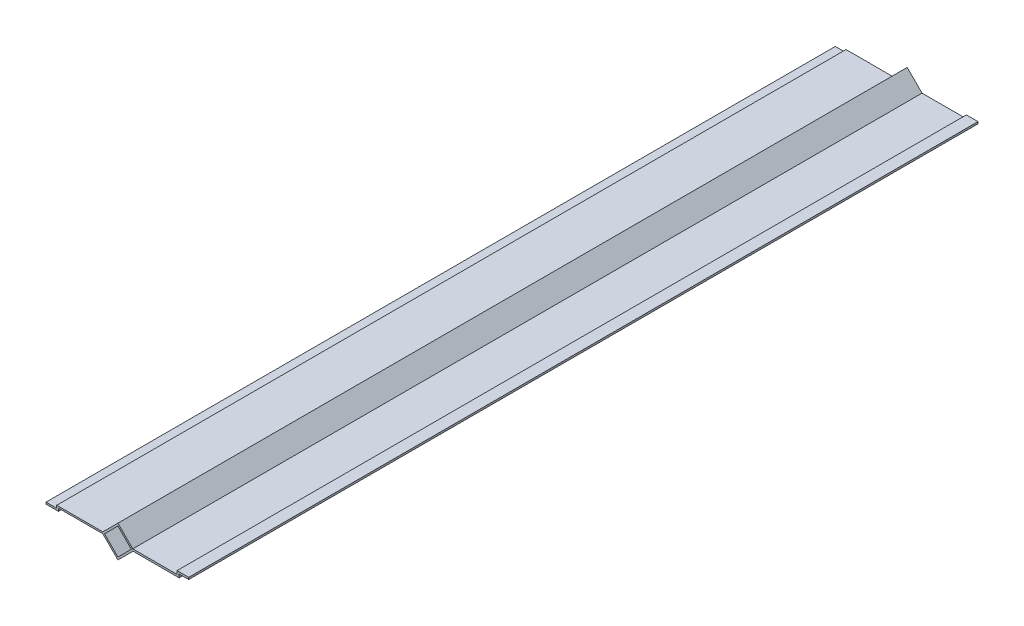
ISO-10303-21;
HEADER;
FILE_DESCRIPTION(('STEP AP214'),'2;1');
FILE_NAME('part.step','',(''),(''),'','','');
FILE_SCHEMA(('AUTOMOTIVE_DESIGN { 1 0 10303 214 1 1 1 1 }'));
ENDSEC;
DATA;
#1=APPLICATION_CONTEXT('core data for automotive mechanical design processes');
#2=APPLICATION_PROTOCOL_DEFINITION('international standard','automotive_design',2000,#1);
#3=PRODUCT_CONTEXT('',#1,'mechanical');
#4=PRODUCT('Part','Part','',(#3));
#5=PRODUCT_RELATED_PRODUCT_CATEGORY('part','',(#4));
#6=PRODUCT_DEFINITION_FORMATION('','',#4);
#7=PRODUCT_DEFINITION_CONTEXT('part definition',#1,'design');
#8=PRODUCT_DEFINITION('design','',#6,#7);
#9=PRODUCT_DEFINITION_SHAPE('','',#8);
#10=(LENGTH_UNIT() NAMED_UNIT(*) SI_UNIT(.MILLI.,.METRE.));
#11=(NAMED_UNIT(*) PLANE_ANGLE_UNIT() SI_UNIT($,.RADIAN.));
#12=(NAMED_UNIT(*) SI_UNIT($,.STERADIAN.) SOLID_ANGLE_UNIT());
#13=UNCERTAINTY_MEASURE_WITH_UNIT(LENGTH_MEASURE(1.E-05),#10,'distance_accuracy_value','');
#14=(GEOMETRIC_REPRESENTATION_CONTEXT(3) GLOBAL_UNCERTAINTY_ASSIGNED_CONTEXT((#13)) GLOBAL_UNIT_ASSIGNED_CONTEXT((#10,
#11,#12)) REPRESENTATION_CONTEXT('',''));
#15=CARTESIAN_POINT('',(0.,0.,0.));
#16=DIRECTION('',(0.,0.,1.));
#17=DIRECTION('',(1.,0.,0.));
#18=AXIS2_PLACEMENT_3D('',#15,#16,#17);
#19=CARTESIAN_POINT('',(0.,0.,882.));
#20=DIRECTION('',(0.,0.,1.));
#21=DIRECTION('',(1.,0.,0.));
#22=AXIS2_PLACEMENT_3D('',#19,#20,#21);
#23=PLANE('',#22);
#24=DIRECTION('',(1.,0.,0.));
#25=VECTOR('',#24,1.);
#26=CARTESIAN_POINT('',(-66.3850920961933,-4.0433350285529,882.));
#27=LINE('',#26,#25);
#28=CARTESIAN_POINT('',(-80.3850920961933,-4.0433350285529,882.));
#29=VERTEX_POINT('',#28);
#30=CARTESIAN_POINT('',(-66.3850920961933,-4.0433350285529,882.));
#31=VERTEX_POINT('',#30);
#32=EDGE_CURVE('E218',#29,#31,#27,.T.);
#33=ORIENTED_EDGE('',*,*,#32,.T.);
#34=DIRECTION('',(0.,1.,0.));
#35=VECTOR('',#34,1.);
#36=CARTESIAN_POINT('',(-66.3850920961933,-2.0433350285529,882.));
#37=LINE('',#36,#35);
#38=CARTESIAN_POINT('',(-66.3850920961933,-0.943335028552887,882.));
#39=VERTEX_POINT('',#38);
#40=EDGE_CURVE('E221',#31,#39,#37,.T.);
#41=ORIENTED_EDGE('',*,*,#40,.T.);
#42=DIRECTION('',(1.,0.,0.));
#43=VECTOR('',#42,1.);
#44=CARTESIAN_POINT('',(-66.3850920961933,-0.943335028552887,882.));
#45=LINE('',#44,#43);
#46=CARTESIAN_POINT('',(-16.8850920961933,-0.943335028552887,882.));
#47=VERTEX_POINT('',#46);
#48=EDGE_CURVE('E224',#39,#47,#45,.T.);
#49=ORIENTED_EDGE('',*,*,#48,.T.);
#50=DIRECTION('',(0.707106781186548,-0.707106781186547,0.));
#51=VECTOR('',#50,1.);
#52=CARTESIAN_POINT('',(-16.8850920961933,-0.943335028552887,882.));
#53=LINE('',#52,#51);
#54=CARTESIAN_POINT('',(0.,-17.8284271247462,882.));
#55=VERTEX_POINT('',#54);
#56=EDGE_CURVE('E226',#47,#55,#53,.T.);
#57=ORIENTED_EDGE('',*,*,#56,.T.);
#58=DIRECTION('',(0.707106781186547,0.707106781186548,0.));
#59=VECTOR('',#58,1.);
#60=CARTESIAN_POINT('',(16.8850920961933,-0.943335028552883,882.));
#61=LINE('',#60,#59);
#62=CARTESIAN_POINT('',(16.8850920961933,-0.943335028552883,882.));
#63=VERTEX_POINT('',#62);
#64=EDGE_CURVE('E228',#55,#63,#61,.T.);
#65=ORIENTED_EDGE('',*,*,#64,.T.);
#66=DIRECTION('',(1.,0.,0.));
#67=VECTOR('',#66,1.);
#68=CARTESIAN_POINT('',(68.3850920961933,-0.943335028552877,882.));
#69=LINE('',#68,#67);
#70=CARTESIAN_POINT('',(68.3850920961933,-0.943335028552877,882.));
#71=VERTEX_POINT('',#70);
#72=EDGE_CURVE('E230',#63,#71,#69,.T.);
#73=ORIENTED_EDGE('',*,*,#72,.T.);
#74=DIRECTION('',(0.,1.,0.));
#75=VECTOR('',#74,1.);
#76=CARTESIAN_POINT('',(68.3850920961933,2.75666497144708,882.));
#77=LINE('',#76,#75);
#78=CARTESIAN_POINT('',(68.3850920961933,2.75666497144708,882.));
#79=VERTEX_POINT('',#78);
#80=EDGE_CURVE('E232',#71,#79,#77,.T.);
#81=ORIENTED_EDGE('',*,*,#80,.T.);
#82=DIRECTION('',(1.,0.,0.));
#83=VECTOR('',#82,1.);
#84=CARTESIAN_POINT('',(68.3850920961933,2.75666497144708,882.));
#85=LINE('',#84,#83);
#86=CARTESIAN_POINT('',(79.0907630522999,2.75666497144708,882.));
#87=VERTEX_POINT('',#86);
#88=EDGE_CURVE('E234',#79,#87,#85,.T.);
#89=ORIENTED_EDGE('',*,*,#88,.T.);
#90=DIRECTION('',(0.,1.,0.));
#91=VECTOR('',#90,1.);
#92=CARTESIAN_POINT('',(79.0907630522999,4.93766407244627,882.));
#93=LINE('',#92,#91);
#94=CARTESIAN_POINT('',(79.0907630522999,4.93766407244627,882.));
#95=VERTEX_POINT('',#94);
#96=EDGE_CURVE('E236',#87,#95,#93,.T.);
#97=ORIENTED_EDGE('',*,*,#96,.T.);
#98=DIRECTION('',(-1.,0.,0.));
#99=VECTOR('',#98,1.);
#100=CARTESIAN_POINT('',(66.0907630522999,4.93766407244627,882.));
#101=LINE('',#100,#99);
#102=CARTESIAN_POINT('',(66.0907630522999,4.93766407244627,882.));
#103=VERTEX_POINT('',#102);
#104=EDGE_CURVE('E238',#95,#103,#101,.T.);
#105=ORIENTED_EDGE('',*,*,#104,.T.);
#106=DIRECTION('',(0.,-1.,0.));
#107=VECTOR('',#106,1.);
#108=CARTESIAN_POINT('',(66.0907630522999,2.93766407244627,882.));
#109=LINE('',#108,#107);
#110=CARTESIAN_POINT('',(66.0907630522999,1.23766407244624,882.));
#111=VERTEX_POINT('',#110);
#112=EDGE_CURVE('E240',#103,#111,#109,.T.);
#113=ORIENTED_EDGE('',*,*,#112,.T.);
#114=DIRECTION('',(-1.,0.,0.));
#115=VECTOR('',#114,1.);
#116=CARTESIAN_POINT('',(66.0907630522999,1.23766407244624,882.));
#117=LINE('',#116,#115);
#118=CARTESIAN_POINT('',(16.5907630523,1.23766407244624,882.));
#119=VERTEX_POINT('',#118);
#120=EDGE_CURVE('E242',#111,#119,#117,.T.);
#121=ORIENTED_EDGE('',*,*,#120,.T.);
#122=DIRECTION('',(-0.707106781186548,0.707106781186547,0.));
#123=VECTOR('',#122,1.);
#124=CARTESIAN_POINT('',(0.,17.8284271247462,882.));
#125=LINE('',#124,#123);
#126=CARTESIAN_POINT('',(0.,17.8284271247462,882.));
#127=VERTEX_POINT('',#126);
#128=EDGE_CURVE('E244',#119,#127,#125,.T.);
#129=ORIENTED_EDGE('',*,*,#128,.T.);
#130=DIRECTION('',(-0.707106781186547,-0.707106781186548,0.));
#131=VECTOR('',#130,1.);
#132=CARTESIAN_POINT('',(-16.8850920961933,0.943335028552874,882.));
#133=LINE('',#132,#131);
#134=CARTESIAN_POINT('',(-16.8850920961933,0.943335028552874,882.));
#135=VERTEX_POINT('',#134);
#136=EDGE_CURVE('E246',#127,#135,#133,.T.);
#137=ORIENTED_EDGE('',*,*,#136,.T.);
#138=DIRECTION('',(-1.,0.,0.));
#139=VECTOR('',#138,1.);
#140=CARTESIAN_POINT('',(-66.3850920961933,0.943335028552874,882.));
#141=LINE('',#140,#139);
#142=CARTESIAN_POINT('',(-68.3850920961933,0.943335028552874,882.));
#143=VERTEX_POINT('',#142);
#144=EDGE_CURVE('E248',#135,#143,#141,.T.);
#145=ORIENTED_EDGE('',*,*,#144,.T.);
#146=DIRECTION('',(0.,-1.,0.));
#147=VECTOR('',#146,1.);
#148=CARTESIAN_POINT('',(-68.3850920961933,-2.0433350285529,882.));
#149=LINE('',#148,#147);
#150=CARTESIAN_POINT('',(-68.3850920961933,-2.0433350285529,882.));
#151=VERTEX_POINT('',#150);
#152=EDGE_CURVE('E250',#143,#151,#149,.T.);
#153=ORIENTED_EDGE('',*,*,#152,.T.);
#154=DIRECTION('',(-1.,0.,0.));
#155=VECTOR('',#154,1.);
#156=CARTESIAN_POINT('',(-68.3850920961933,-2.0433350285529,882.));
#157=LINE('',#156,#155);
#158=CARTESIAN_POINT('',(-80.3850920961933,-2.04333502855289,882.));
#159=VERTEX_POINT('',#158);
#160=EDGE_CURVE('E252',#151,#159,#157,.T.);
#161=ORIENTED_EDGE('',*,*,#160,.T.);
#162=DIRECTION('',(0.,-1.,0.));
#163=VECTOR('',#162,1.);
#164=CARTESIAN_POINT('',(-80.3850920961933,-2.04333502855289,882.));
#165=LINE('',#164,#163);
#166=EDGE_CURVE('E254',#159,#29,#165,.T.);
#167=ORIENTED_EDGE('',*,*,#166,.T.);
#168=EDGE_LOOP('',(#33,#41,#49,#57,#65,#73,#81,#89,#97,#105,#113,#121,#129,#137,#145,#153,#161,#167));
#169=FACE_BOUND('',#168,.T.);
#170=DIRECTION('',(0.707106781186547,0.707106781186548,0.));
#171=VECTOR('',#170,1.);
#172=CARTESIAN_POINT('',(15.,0.,882.));
#173=LINE('',#172,#171);
#174=CARTESIAN_POINT('',(0.,-15.,882.));
#175=VERTEX_POINT('',#174);
#176=CARTESIAN_POINT('',(15.,0.,882.));
#177=VERTEX_POINT('',#176);
#178=EDGE_CURVE('E190',#175,#177,#173,.T.);
#179=ORIENTED_EDGE('',*,*,#178,.F.);
#180=DIRECTION('',(0.707106781186548,-0.707106781186547,0.));
#181=VECTOR('',#180,1.);
#182=CARTESIAN_POINT('',(-15.,0.,882.));
#183=LINE('',#182,#181);
#184=CARTESIAN_POINT('',(-15.,0.,882.));
#185=VERTEX_POINT('',#184);
#186=EDGE_CURVE('E182',#185,#175,#183,.T.);
#187=ORIENTED_EDGE('',*,*,#186,.F.);
#188=DIRECTION('',(-0.707106781186547,-0.707106781186548,0.));
#189=VECTOR('',#188,1.);
#190=CARTESIAN_POINT('',(-15.,0.,882.));
#191=LINE('',#190,#189);
#192=CARTESIAN_POINT('',(0.,15.,882.));
#193=VERTEX_POINT('',#192);
#194=EDGE_CURVE('E204',#193,#185,#191,.T.);
#195=ORIENTED_EDGE('',*,*,#194,.F.);
#196=DIRECTION('',(-0.707106781186548,0.707106781186547,0.));
#197=VECTOR('',#196,1.);
#198=CARTESIAN_POINT('',(0.,15.,882.));
#199=LINE('',#198,#197);
#200=EDGE_CURVE('E202',#177,#193,#199,.T.);
#201=ORIENTED_EDGE('',*,*,#200,.F.);
#202=EDGE_LOOP('',(#179,#187,#195,#201));
#203=FACE_BOUND('',#202,.T.);
#204=ADVANCED_FACE('F33',(#169,#203),#23,.T.);
#205=CARTESIAN_POINT('',(0.,0.,0.));
#206=DIRECTION('',(0.,0.,1.));
#207=DIRECTION('',(1.,0.,0.));
#208=AXIS2_PLACEMENT_3D('',#205,#206,#207);
#209=PLANE('',#208);
#210=DIRECTION('',(0.,1.,0.));
#211=VECTOR('',#210,1.);
#212=CARTESIAN_POINT('',(-66.3850920961933,-0.943335028552887,0.));
#213=LINE('',#212,#211);
#214=CARTESIAN_POINT('',(-66.3850920961933,-4.0433350285529,0.));
#215=VERTEX_POINT('',#214);
#216=CARTESIAN_POINT('',(-66.3850920961933,-0.943335028552887,0.));
#217=VERTEX_POINT('',#216);
#218=EDGE_CURVE('E198',#215,#217,#213,.T.);
#219=ORIENTED_EDGE('',*,*,#218,.F.);
#220=DIRECTION('',(1.,0.,0.));
#221=VECTOR('',#220,1.);
#222=CARTESIAN_POINT('',(-68.3850920961933,-4.0433350285529,0.));
#223=LINE('',#222,#221);
#224=CARTESIAN_POINT('',(-80.3850920961933,-4.0433350285529,0.));
#225=VERTEX_POINT('',#224);
#226=EDGE_CURVE('E222',#225,#215,#223,.T.);
#227=ORIENTED_EDGE('',*,*,#226,.F.);
#228=DIRECTION('',(0.,-1.,0.));
#229=VECTOR('',#228,1.);
#230=CARTESIAN_POINT('',(-80.3850920961933,-2.04333502855289,0.));
#231=LINE('',#230,#229);
#232=CARTESIAN_POINT('',(-80.3850920961933,-2.04333502855289,0.));
#233=VERTEX_POINT('',#232);
#234=EDGE_CURVE('E291',#233,#225,#231,.T.);
#235=ORIENTED_EDGE('',*,*,#234,.F.);
#236=DIRECTION('',(-1.,0.,0.));
#237=VECTOR('',#236,1.);
#238=CARTESIAN_POINT('',(-68.3850920961933,-2.0433350285529,0.));
#239=LINE('',#238,#237);
#240=CARTESIAN_POINT('',(-68.3850920961933,-2.0433350285529,0.));
#241=VERTEX_POINT('',#240);
#242=EDGE_CURVE('E289',#241,#233,#239,.T.);
#243=ORIENTED_EDGE('',*,*,#242,.F.);
#244=DIRECTION('',(0.,-1.,0.));
#245=VECTOR('',#244,1.);
#246=CARTESIAN_POINT('',(-68.3850920961933,-2.0433350285529,0.));
#247=LINE('',#246,#245);
#248=CARTESIAN_POINT('',(-68.3850920961933,0.943335028552874,0.));
#249=VERTEX_POINT('',#248);
#250=EDGE_CURVE('E287',#249,#241,#247,.T.);
#251=ORIENTED_EDGE('',*,*,#250,.F.);
#252=DIRECTION('',(-1.,0.,0.));
#253=VECTOR('',#252,1.);
#254=CARTESIAN_POINT('',(-68.3850920961933,0.943335028552874,0.));
#255=LINE('',#254,#253);
#256=CARTESIAN_POINT('',(-16.8850920961933,0.943335028552874,0.));
#257=VERTEX_POINT('',#256);
#258=EDGE_CURVE('E285',#257,#249,#255,.T.);
#259=ORIENTED_EDGE('',*,*,#258,.F.);
#260=DIRECTION('',(-0.707106781186547,-0.707106781186548,0.));
#261=VECTOR('',#260,1.);
#262=CARTESIAN_POINT('',(-16.8850920961933,0.943335028552874,0.));
#263=LINE('',#262,#261);
#264=CARTESIAN_POINT('',(0.,17.8284271247462,0.));
#265=VERTEX_POINT('',#264);
#266=EDGE_CURVE('E282',#265,#257,#263,.T.);
#267=ORIENTED_EDGE('',*,*,#266,.F.);
#268=DIRECTION('',(-0.707106781186548,0.707106781186547,0.));
#269=VECTOR('',#268,1.);
#270=CARTESIAN_POINT('',(0.,17.8284271247462,0.));
#271=LINE('',#270,#269);
#272=CARTESIAN_POINT('',(16.5907630523,1.23766407244624,0.));
#273=VERTEX_POINT('',#272);
#274=EDGE_CURVE('E280',#273,#265,#271,.T.);
#275=ORIENTED_EDGE('',*,*,#274,.F.);
#276=DIRECTION('',(-1.,0.,0.));
#277=VECTOR('',#276,1.);
#278=CARTESIAN_POINT('',(66.0907630522999,1.23766407244624,0.));
#279=LINE('',#278,#277);
#280=CARTESIAN_POINT('',(66.0907630522999,1.23766407244624,0.));
#281=VERTEX_POINT('',#280);
#282=EDGE_CURVE('E278',#281,#273,#279,.T.);
#283=ORIENTED_EDGE('',*,*,#282,.F.);
#284=DIRECTION('',(0.,-1.,0.));
#285=VECTOR('',#284,1.);
#286=CARTESIAN_POINT('',(66.0907630522999,1.23766407244624,0.));
#287=LINE('',#286,#285);
#288=CARTESIAN_POINT('',(66.0907630522999,4.93766407244627,0.));
#289=VERTEX_POINT('',#288);
#290=EDGE_CURVE('E276',#289,#281,#287,.T.);
#291=ORIENTED_EDGE('',*,*,#290,.F.);
#292=DIRECTION('',(-1.,0.,0.));
#293=VECTOR('',#292,1.);
#294=CARTESIAN_POINT('',(66.0907630522999,4.93766407244627,0.));
#295=LINE('',#294,#293);
#296=CARTESIAN_POINT('',(79.0907630522999,4.93766407244627,0.));
#297=VERTEX_POINT('',#296);
#298=EDGE_CURVE('E273',#297,#289,#295,.T.);
#299=ORIENTED_EDGE('',*,*,#298,.F.);
#300=DIRECTION('',(0.,1.,0.));
#301=VECTOR('',#300,1.);
#302=CARTESIAN_POINT('',(79.0907630522999,4.93766407244627,0.));
#303=LINE('',#302,#301);
#304=CARTESIAN_POINT('',(79.0907630522999,2.75666497144708,0.));
#305=VERTEX_POINT('',#304);
#306=EDGE_CURVE('E271',#305,#297,#303,.T.);
#307=ORIENTED_EDGE('',*,*,#306,.F.);
#308=DIRECTION('',(1.,0.,0.));
#309=VECTOR('',#308,1.);
#310=CARTESIAN_POINT('',(68.3850920961933,2.75666497144708,0.));
#311=LINE('',#310,#309);
#312=CARTESIAN_POINT('',(68.3850920961933,2.75666497144708,0.));
#313=VERTEX_POINT('',#312);
#314=EDGE_CURVE('E269',#313,#305,#311,.T.);
#315=ORIENTED_EDGE('',*,*,#314,.F.);
#316=DIRECTION('',(0.,1.,0.));
#317=VECTOR('',#316,1.);
#318=CARTESIAN_POINT('',(68.3850920961933,2.75666497144708,0.));
#319=LINE('',#318,#317);
#320=CARTESIAN_POINT('',(68.3850920961933,-0.943335028552877,0.));
#321=VERTEX_POINT('',#320);
#322=EDGE_CURVE('E267',#321,#313,#319,.T.);
#323=ORIENTED_EDGE('',*,*,#322,.F.);
#324=DIRECTION('',(1.,0.,0.));
#325=VECTOR('',#324,1.);
#326=CARTESIAN_POINT('',(68.3850920961933,-0.943335028552877,0.));
#327=LINE('',#326,#325);
#328=CARTESIAN_POINT('',(16.8850920961933,-0.943335028552883,0.));
#329=VERTEX_POINT('',#328);
#330=EDGE_CURVE('E265',#329,#321,#327,.T.);
#331=ORIENTED_EDGE('',*,*,#330,.F.);
#332=DIRECTION('',(0.707106781186547,0.707106781186548,0.));
#333=VECTOR('',#332,1.);
#334=CARTESIAN_POINT('',(16.8850920961933,-0.943335028552883,0.));
#335=LINE('',#334,#333);
#336=CARTESIAN_POINT('',(0.,-17.8284271247462,0.));
#337=VERTEX_POINT('',#336);
#338=EDGE_CURVE('E263',#337,#329,#335,.T.);
#339=ORIENTED_EDGE('',*,*,#338,.F.);
#340=DIRECTION('',(0.707106781186548,-0.707106781186547,0.));
#341=VECTOR('',#340,1.);
#342=CARTESIAN_POINT('',(-16.8850920961933,-0.943335028552887,0.));
#343=LINE('',#342,#341);
#344=CARTESIAN_POINT('',(-16.8850920961933,-0.943335028552887,0.));
#345=VERTEX_POINT('',#344);
#346=EDGE_CURVE('E261',#345,#337,#343,.T.);
#347=ORIENTED_EDGE('',*,*,#346,.F.);
#348=DIRECTION('',(1.,0.,0.));
#349=VECTOR('',#348,1.);
#350=CARTESIAN_POINT('',(-66.3850920961933,-0.943335028552887,0.));
#351=LINE('',#350,#349);
#352=EDGE_CURVE('E259',#217,#345,#351,.T.);
#353=ORIENTED_EDGE('',*,*,#352,.F.);
#354=EDGE_LOOP('',(#219,#227,#235,#243,#251,#259,#267,#275,#283,#291,#299,#307,#315,#323,#331,
#339,#347,#353));
#355=FACE_BOUND('',#354,.T.);
#356=DIRECTION('',(0.707106781186548,-0.707106781186547,0.));
#357=VECTOR('',#356,1.);
#358=CARTESIAN_POINT('',(-15.,0.,0.));
#359=LINE('',#358,#357);
#360=CARTESIAN_POINT('',(-15.,0.,0.));
#361=VERTEX_POINT('',#360);
#362=CARTESIAN_POINT('',(0.,-15.,0.));
#363=VERTEX_POINT('',#362);
#364=EDGE_CURVE('E56',#361,#363,#359,.T.);
#365=ORIENTED_EDGE('',*,*,#364,.T.);
#366=DIRECTION('',(0.707106781186547,0.707106781186548,0.));
#367=VECTOR('',#366,1.);
#368=CARTESIAN_POINT('',(15.,0.,0.));
#369=LINE('',#368,#367);
#370=CARTESIAN_POINT('',(15.,0.,0.));
#371=VERTEX_POINT('',#370);
#372=EDGE_CURVE('E197',#363,#371,#369,.T.);
#373=ORIENTED_EDGE('',*,*,#372,.T.);
#374=DIRECTION('',(-0.707106781186548,0.707106781186547,0.));
#375=VECTOR('',#374,1.);
#376=CARTESIAN_POINT('',(0.,15.,0.));
#377=LINE('',#376,#375);
#378=CARTESIAN_POINT('',(0.,15.,0.));
#379=VERTEX_POINT('',#378);
#380=EDGE_CURVE('E210',#371,#379,#377,.T.);
#381=ORIENTED_EDGE('',*,*,#380,.T.);
#382=DIRECTION('',(-0.707106781186547,-0.707106781186548,0.));
#383=VECTOR('',#382,1.);
#384=CARTESIAN_POINT('',(-15.,0.,0.));
#385=LINE('',#384,#383);
#386=EDGE_CURVE('E191',#379,#361,#385,.T.);
#387=ORIENTED_EDGE('',*,*,#386,.T.);
#388=EDGE_LOOP('',(#365,#373,#381,#387));
#389=FACE_BOUND('',#388,.T.);
#390=ADVANCED_FACE('F351',(#355,#389),#209,.F.);
#391=CARTESIAN_POINT('',(-66.3850920961933,-0.943335028552887,882.));
#392=DIRECTION('',(-1.,0.,0.));
#393=DIRECTION('',(0.,0.,1.));
#394=AXIS2_PLACEMENT_3D('',#391,#392,#393);
#395=PLANE('',#394);
#396=ORIENTED_EDGE('',*,*,#218,.T.);
#397=DIRECTION('',(0.,0.,-1.));
#398=VECTOR('',#397,1.);
#399=CARTESIAN_POINT('',(-66.3850920961933,-0.943335028552887,882.));
#400=LINE('',#399,#398);
#401=EDGE_CURVE('E41',#39,#217,#400,.T.);
#402=ORIENTED_EDGE('',*,*,#401,.F.);
#403=ORIENTED_EDGE('',*,*,#40,.F.);
#404=DIRECTION('',(0.,0.,-1.));
#405=VECTOR('',#404,1.);
#406=CARTESIAN_POINT('',(-66.3850920961933,-4.0433350285529,882.));
#407=LINE('',#406,#405);
#408=EDGE_CURVE('E11',#31,#215,#407,.T.);
#409=ORIENTED_EDGE('',*,*,#408,.T.);
#410=EDGE_LOOP('',(#396,#402,#403,#409));
#411=FACE_BOUND('',#410,.T.);
#412=ADVANCED_FACE('F35',(#411),#395,.F.);
#413=CARTESIAN_POINT('',(-66.3850920961933,-0.943335028552887,882.));
#414=DIRECTION('',(0.,1.,0.));
#415=DIRECTION('',(-1.,0.,0.));
#416=AXIS2_PLACEMENT_3D('',#413,#414,#415);
#417=PLANE('',#416);
#418=ORIENTED_EDGE('',*,*,#352,.T.);
#419=DIRECTION('',(0.,0.,-1.));
#420=VECTOR('',#419,1.);
#421=CARTESIAN_POINT('',(-16.8850920961933,-0.943335028552887,882.));
#422=LINE('',#421,#420);
#423=EDGE_CURVE('E339',#47,#345,#422,.T.);
#424=ORIENTED_EDGE('',*,*,#423,.F.);
#425=ORIENTED_EDGE('',*,*,#48,.F.);
#426=ORIENTED_EDGE('',*,*,#401,.T.);
#427=EDGE_LOOP('',(#418,#424,#425,#426));
#428=FACE_BOUND('',#427,.T.);
#429=ADVANCED_FACE('F346',(#428),#417,.F.);
#430=CARTESIAN_POINT('',(-16.8850920961933,-0.943335028552887,882.));
#431=DIRECTION('',(0.707106781186547,0.707106781186548,0.));
#432=DIRECTION('',(-0.707106781186548,0.707106781186547,0.));
#433=AXIS2_PLACEMENT_3D('',#430,#431,#432);
#434=PLANE('',#433);
#435=ORIENTED_EDGE('',*,*,#346,.T.);
#436=DIRECTION('',(0.,0.,-1.));
#437=VECTOR('',#436,1.);
#438=CARTESIAN_POINT('',(0.,-17.8284271247462,882.));
#439=LINE('',#438,#437);
#440=EDGE_CURVE('E336',#55,#337,#439,.T.);
#441=ORIENTED_EDGE('',*,*,#440,.F.);
#442=ORIENTED_EDGE('',*,*,#56,.F.);
#443=ORIENTED_EDGE('',*,*,#423,.T.);
#444=EDGE_LOOP('',(#435,#441,#442,#443));
#445=FACE_BOUND('',#444,.T.);
#446=ADVANCED_FACE('F358',(#445),#434,.F.);
#447=CARTESIAN_POINT('',(16.8850920961933,-0.943335028552883,882.));
#448=DIRECTION('',(-0.707106781186548,0.707106781186547,0.));
#449=DIRECTION('',(-0.707106781186547,-0.707106781186548,0.));
#450=AXIS2_PLACEMENT_3D('',#447,#448,#449);
#451=PLANE('',#450);
#452=ORIENTED_EDGE('',*,*,#338,.T.);
#453=DIRECTION('',(0.,0.,-1.));
#454=VECTOR('',#453,1.);
#455=CARTESIAN_POINT('',(16.8850920961933,-0.943335028552883,882.));
#456=LINE('',#455,#454);
#457=EDGE_CURVE('E333',#63,#329,#456,.T.);
#458=ORIENTED_EDGE('',*,*,#457,.F.);
#459=ORIENTED_EDGE('',*,*,#64,.F.);
#460=ORIENTED_EDGE('',*,*,#440,.T.);
#461=EDGE_LOOP('',(#452,#458,#459,#460));
#462=FACE_BOUND('',#461,.T.);
#463=ADVANCED_FACE('F362',(#462),#451,.F.);
#464=CARTESIAN_POINT('',(68.3850920961933,-0.943335028552877,882.));
#465=DIRECTION('',(0.,1.,0.));
#466=DIRECTION('',(-1.,0.,0.));
#467=AXIS2_PLACEMENT_3D('',#464,#465,#466);
#468=PLANE('',#467);
#469=ORIENTED_EDGE('',*,*,#330,.T.);
#470=DIRECTION('',(0.,0.,-1.));
#471=VECTOR('',#470,1.);
#472=CARTESIAN_POINT('',(68.3850920961933,-0.943335028552877,882.));
#473=LINE('',#472,#471);
#474=EDGE_CURVE('E330',#71,#321,#473,.T.);
#475=ORIENTED_EDGE('',*,*,#474,.F.);
#476=ORIENTED_EDGE('',*,*,#72,.F.);
#477=ORIENTED_EDGE('',*,*,#457,.T.);
#478=EDGE_LOOP('',(#469,#475,#476,#477));
#479=FACE_BOUND('',#478,.T.);
#480=ADVANCED_FACE('F429',(#479),#468,.F.);
#481=CARTESIAN_POINT('',(68.3850920961933,2.75666497144708,882.));
#482=DIRECTION('',(-1.,0.,0.));
#483=DIRECTION('',(0.,0.,1.));
#484=AXIS2_PLACEMENT_3D('',#481,#482,#483);
#485=PLANE('',#484);
#486=ORIENTED_EDGE('',*,*,#322,.T.);
#487=DIRECTION('',(0.,0.,-1.));
#488=VECTOR('',#487,1.);
#489=CARTESIAN_POINT('',(68.3850920961933,2.75666497144708,882.));
#490=LINE('',#489,#488);
#491=EDGE_CURVE('E327',#79,#313,#490,.T.);
#492=ORIENTED_EDGE('',*,*,#491,.F.);
#493=ORIENTED_EDGE('',*,*,#80,.F.);
#494=ORIENTED_EDGE('',*,*,#474,.T.);
#495=EDGE_LOOP('',(#486,#492,#493,#494));
#496=FACE_BOUND('',#495,.T.);
#497=ADVANCED_FACE('F427',(#496),#485,.F.);
#498=CARTESIAN_POINT('',(68.3850920961933,2.75666497144708,882.));
#499=DIRECTION('',(0.,1.,0.));
#500=DIRECTION('',(-1.,0.,0.));
#501=AXIS2_PLACEMENT_3D('',#498,#499,#500);
#502=PLANE('',#501);
#503=ORIENTED_EDGE('',*,*,#314,.T.);
#504=DIRECTION('',(0.,0.,-1.));
#505=VECTOR('',#504,1.);
#506=CARTESIAN_POINT('',(79.0907630522999,2.75666497144708,882.));
#507=LINE('',#506,#505);
#508=EDGE_CURVE('E324',#87,#305,#507,.T.);
#509=ORIENTED_EDGE('',*,*,#508,.F.);
#510=ORIENTED_EDGE('',*,*,#88,.F.);
#511=ORIENTED_EDGE('',*,*,#491,.T.);
#512=EDGE_LOOP('',(#503,#509,#510,#511));
#513=FACE_BOUND('',#512,.T.);
#514=ADVANCED_FACE('F423',(#513),#502,.F.);
#515=CARTESIAN_POINT('',(79.0907630522999,4.93766407244627,882.));
#516=DIRECTION('',(-1.,0.,0.));
#517=DIRECTION('',(0.,0.,1.));
#518=AXIS2_PLACEMENT_3D('',#515,#516,#517);
#519=PLANE('',#518);
#520=ORIENTED_EDGE('',*,*,#306,.T.);
#521=DIRECTION('',(0.,0.,-1.));
#522=VECTOR('',#521,1.);
#523=CARTESIAN_POINT('',(79.0907630522999,4.93766407244627,882.));
#524=LINE('',#523,#522);
#525=EDGE_CURVE('E321',#95,#297,#524,.T.);
#526=ORIENTED_EDGE('',*,*,#525,.F.);
#527=ORIENTED_EDGE('',*,*,#96,.F.);
#528=ORIENTED_EDGE('',*,*,#508,.T.);
#529=EDGE_LOOP('',(#520,#526,#527,#528));
#530=FACE_BOUND('',#529,.T.);
#531=ADVANCED_FACE('F418',(#530),#519,.F.);
#532=CARTESIAN_POINT('',(66.0907630522999,4.93766407244627,882.));
#533=DIRECTION('',(0.,-1.,0.));
#534=DIRECTION('',(0.,0.,-1.));
#535=AXIS2_PLACEMENT_3D('',#532,#533,#534);
#536=PLANE('',#535);
#537=ORIENTED_EDGE('',*,*,#298,.T.);
#538=DIRECTION('',(0.,0.,-1.));
#539=VECTOR('',#538,1.);
#540=CARTESIAN_POINT('',(66.0907630522999,4.93766407244627,882.));
#541=LINE('',#540,#539);
#542=EDGE_CURVE('E318',#103,#289,#541,.T.);
#543=ORIENTED_EDGE('',*,*,#542,.F.);
#544=ORIENTED_EDGE('',*,*,#104,.F.);
#545=ORIENTED_EDGE('',*,*,#525,.T.);
#546=EDGE_LOOP('',(#537,#543,#544,#545));
#547=FACE_BOUND('',#546,.T.);
#548=ADVANCED_FACE('F412',(#547),#536,.F.);
#549=CARTESIAN_POINT('',(66.0907630522999,1.23766407244624,882.));
#550=DIRECTION('',(1.,0.,0.));
#551=DIRECTION('',(0.,0.,-1.));
#552=AXIS2_PLACEMENT_3D('',#549,#550,#551);
#553=PLANE('',#552);
#554=ORIENTED_EDGE('',*,*,#290,.T.);
#555=DIRECTION('',(0.,0.,-1.));
#556=VECTOR('',#555,1.);
#557=CARTESIAN_POINT('',(66.0907630522999,1.23766407244624,882.));
#558=LINE('',#557,#556);
#559=EDGE_CURVE('E315',#111,#281,#558,.T.);
#560=ORIENTED_EDGE('',*,*,#559,.F.);
#561=ORIENTED_EDGE('',*,*,#112,.F.);
#562=ORIENTED_EDGE('',*,*,#542,.T.);
#563=EDGE_LOOP('',(#554,#560,#561,#562));
#564=FACE_BOUND('',#563,.T.);
#565=ADVANCED_FACE('F408',(#564),#553,.F.);
#566=CARTESIAN_POINT('',(66.0907630522999,1.23766407244624,882.));
#567=DIRECTION('',(0.,-1.,0.));
#568=DIRECTION('',(1.,0.,0.));
#569=AXIS2_PLACEMENT_3D('',#566,#567,#568);
#570=PLANE('',#569);
#571=ORIENTED_EDGE('',*,*,#282,.T.);
#572=DIRECTION('',(0.,0.,-1.));
#573=VECTOR('',#572,1.);
#574=CARTESIAN_POINT('',(16.5907630523,1.23766407244624,882.));
#575=LINE('',#574,#573);
#576=EDGE_CURVE('E312',#119,#273,#575,.T.);
#577=ORIENTED_EDGE('',*,*,#576,.F.);
#578=ORIENTED_EDGE('',*,*,#120,.F.);
#579=ORIENTED_EDGE('',*,*,#559,.T.);
#580=EDGE_LOOP('',(#571,#577,#578,#579));
#581=FACE_BOUND('',#580,.T.);
#582=ADVANCED_FACE('F404',(#581),#570,.F.);
#583=CARTESIAN_POINT('',(0.,17.8284271247462,882.));
#584=DIRECTION('',(-0.707106781186547,-0.707106781186548,0.));
#585=DIRECTION('',(0.707106781186548,-0.707106781186547,0.));
#586=AXIS2_PLACEMENT_3D('',#583,#584,#585);
#587=PLANE('',#586);
#588=ORIENTED_EDGE('',*,*,#274,.T.);
#589=DIRECTION('',(0.,0.,-1.));
#590=VECTOR('',#589,1.);
#591=CARTESIAN_POINT('',(0.,17.8284271247462,882.));
#592=LINE('',#591,#590);
#593=EDGE_CURVE('E309',#127,#265,#592,.T.);
#594=ORIENTED_EDGE('',*,*,#593,.F.);
#595=ORIENTED_EDGE('',*,*,#128,.F.);
#596=ORIENTED_EDGE('',*,*,#576,.T.);
#597=EDGE_LOOP('',(#588,#594,#595,#596));
#598=FACE_BOUND('',#597,.T.);
#599=ADVANCED_FACE('F400',(#598),#587,.F.);
#600=CARTESIAN_POINT('',(-16.8850920961933,0.943335028552874,882.));
#601=DIRECTION('',(0.707106781186548,-0.707106781186547,0.));
#602=DIRECTION('',(0.707106781186547,0.707106781186548,0.));
#603=AXIS2_PLACEMENT_3D('',#600,#601,#602);
#604=PLANE('',#603);
#605=ORIENTED_EDGE('',*,*,#266,.T.);
#606=DIRECTION('',(0.,0.,-1.));
#607=VECTOR('',#606,1.);
#608=CARTESIAN_POINT('',(-16.8850920961933,0.943335028552874,882.));
#609=LINE('',#608,#607);
#610=EDGE_CURVE('E306',#135,#257,#609,.T.);
#611=ORIENTED_EDGE('',*,*,#610,.F.);
#612=ORIENTED_EDGE('',*,*,#136,.F.);
#613=ORIENTED_EDGE('',*,*,#593,.T.);
#614=EDGE_LOOP('',(#605,#611,#612,#613));
#615=FACE_BOUND('',#614,.T.);
#616=ADVANCED_FACE('F391',(#615),#604,.F.);
#617=CARTESIAN_POINT('',(-68.3850920961933,0.943335028552874,882.));
#618=DIRECTION('',(0.,-1.,0.));
#619=DIRECTION('',(0.,0.,-1.));
#620=AXIS2_PLACEMENT_3D('',#617,#618,#619);
#621=PLANE('',#620);
#622=ORIENTED_EDGE('',*,*,#258,.T.);
#623=DIRECTION('',(0.,0.,-1.));
#624=VECTOR('',#623,1.);
#625=CARTESIAN_POINT('',(-68.3850920961933,0.943335028552874,882.));
#626=LINE('',#625,#624);
#627=EDGE_CURVE('E303',#143,#249,#626,.T.);
#628=ORIENTED_EDGE('',*,*,#627,.F.);
#629=ORIENTED_EDGE('',*,*,#144,.F.);
#630=ORIENTED_EDGE('',*,*,#610,.T.);
#631=EDGE_LOOP('',(#622,#628,#629,#630));
#632=FACE_BOUND('',#631,.T.);
#633=ADVANCED_FACE('F395',(#632),#621,.F.);
#634=CARTESIAN_POINT('',(-68.3850920961933,-2.0433350285529,882.));
#635=DIRECTION('',(1.,0.,0.));
#636=DIRECTION('',(0.,0.,-1.));
#637=AXIS2_PLACEMENT_3D('',#634,#635,#636);
#638=PLANE('',#637);
#639=ORIENTED_EDGE('',*,*,#250,.T.);
#640=DIRECTION('',(0.,0.,-1.));
#641=VECTOR('',#640,1.);
#642=CARTESIAN_POINT('',(-68.3850920961933,-2.0433350285529,882.));
#643=LINE('',#642,#641);
#644=EDGE_CURVE('E300',#151,#241,#643,.T.);
#645=ORIENTED_EDGE('',*,*,#644,.F.);
#646=ORIENTED_EDGE('',*,*,#152,.F.);
#647=ORIENTED_EDGE('',*,*,#627,.T.);
#648=EDGE_LOOP('',(#639,#645,#646,#647));
#649=FACE_BOUND('',#648,.T.);
#650=ADVANCED_FACE('F384',(#649),#638,.F.);
#651=CARTESIAN_POINT('',(-68.3850920961933,-2.0433350285529,882.));
#652=DIRECTION('',(0.,-1.,0.));
#653=DIRECTION('',(1.,0.,0.));
#654=AXIS2_PLACEMENT_3D('',#651,#652,#653);
#655=PLANE('',#654);
#656=ORIENTED_EDGE('',*,*,#242,.T.);
#657=DIRECTION('',(0.,0.,-1.));
#658=VECTOR('',#657,1.);
#659=CARTESIAN_POINT('',(-80.3850920961933,-2.04333502855289,882.));
#660=LINE('',#659,#658);
#661=EDGE_CURVE('E297',#159,#233,#660,.T.);
#662=ORIENTED_EDGE('',*,*,#661,.F.);
#663=ORIENTED_EDGE('',*,*,#160,.F.);
#664=ORIENTED_EDGE('',*,*,#644,.T.);
#665=EDGE_LOOP('',(#656,#662,#663,#664));
#666=FACE_BOUND('',#665,.T.);
#667=ADVANCED_FACE('F380',(#666),#655,.F.);
#668=CARTESIAN_POINT('',(-80.3850920961933,-2.04333502855289,882.));
#669=DIRECTION('',(1.,0.,0.));
#670=DIRECTION('',(0.,0.,-1.));
#671=AXIS2_PLACEMENT_3D('',#668,#669,#670);
#672=PLANE('',#671);
#673=ORIENTED_EDGE('',*,*,#234,.T.);
#674=DIRECTION('',(0.,0.,-1.));
#675=VECTOR('',#674,1.);
#676=CARTESIAN_POINT('',(-80.3850920961933,-4.0433350285529,882.));
#677=LINE('',#676,#675);
#678=EDGE_CURVE('E257',#29,#225,#677,.T.);
#679=ORIENTED_EDGE('',*,*,#678,.F.);
#680=ORIENTED_EDGE('',*,*,#166,.F.);
#681=ORIENTED_EDGE('',*,*,#661,.T.);
#682=EDGE_LOOP('',(#673,#679,#680,#681));
#683=FACE_BOUND('',#682,.T.);
#684=ADVANCED_FACE('F375',(#683),#672,.F.);
#685=CARTESIAN_POINT('',(-68.3850920961933,-4.0433350285529,882.));
#686=DIRECTION('',(0.,1.,0.));
#687=DIRECTION('',(-1.,0.,0.));
#688=AXIS2_PLACEMENT_3D('',#685,#686,#687);
#689=PLANE('',#688);
#690=ORIENTED_EDGE('',*,*,#226,.T.);
#691=ORIENTED_EDGE('',*,*,#408,.F.);
#692=ORIENTED_EDGE('',*,*,#32,.F.);
#693=ORIENTED_EDGE('',*,*,#678,.T.);
#694=EDGE_LOOP('',(#690,#691,#692,#693));
#695=FACE_BOUND('',#694,.T.);
#696=ADVANCED_FACE('F369',(#695),#689,.F.);
#697=CARTESIAN_POINT('',(-15.,0.,882.));
#698=DIRECTION('',(0.707106781186547,0.707106781186548,0.));
#699=DIRECTION('',(-0.707106781186548,0.707106781186547,0.));
#700=AXIS2_PLACEMENT_3D('',#697,#698,#699);
#701=PLANE('',#700);
#702=ORIENTED_EDGE('',*,*,#364,.F.);
#703=DIRECTION('',(0.,0.,-1.));
#704=VECTOR('',#703,1.);
#705=CARTESIAN_POINT('',(-15.,0.,882.));
#706=LINE('',#705,#704);
#707=EDGE_CURVE('E186',#185,#361,#706,.T.);
#708=ORIENTED_EDGE('',*,*,#707,.F.);
#709=ORIENTED_EDGE('',*,*,#186,.T.);
#710=DIRECTION('',(0.,0.,-1.));
#711=VECTOR('',#710,1.);
#712=CARTESIAN_POINT('',(0.,-15.,882.));
#713=LINE('',#712,#711);
#714=EDGE_CURVE('E185',#175,#363,#713,.T.);
#715=ORIENTED_EDGE('',*,*,#714,.T.);
#716=EDGE_LOOP('',(#702,#708,#709,#715));
#717=FACE_BOUND('',#716,.T.);
#718=ADVANCED_FACE('F184',(#717),#701,.T.);
#719=CARTESIAN_POINT('',(15.,0.,882.));
#720=DIRECTION('',(-0.707106781186548,0.707106781186547,0.));
#721=DIRECTION('',(-0.707106781186547,-0.707106781186548,0.));
#722=AXIS2_PLACEMENT_3D('',#719,#720,#721);
#723=PLANE('',#722);
#724=ORIENTED_EDGE('',*,*,#372,.F.);
#725=ORIENTED_EDGE('',*,*,#714,.F.);
#726=ORIENTED_EDGE('',*,*,#178,.T.);
#727=DIRECTION('',(0.,0.,-1.));
#728=VECTOR('',#727,1.);
#729=CARTESIAN_POINT('',(15.,0.,882.));
#730=LINE('',#729,#728);
#731=EDGE_CURVE('E199',#177,#371,#730,.T.);
#732=ORIENTED_EDGE('',*,*,#731,.T.);
#733=EDGE_LOOP('',(#724,#725,#726,#732));
#734=FACE_BOUND('',#733,.T.);
#735=ADVANCED_FACE('F194',(#734),#723,.T.);
#736=CARTESIAN_POINT('',(0.,15.,882.));
#737=DIRECTION('',(-0.707106781186547,-0.707106781186548,0.));
#738=DIRECTION('',(0.707106781186548,-0.707106781186547,0.));
#739=AXIS2_PLACEMENT_3D('',#736,#737,#738);
#740=PLANE('',#739);
#741=ORIENTED_EDGE('',*,*,#380,.F.);
#742=ORIENTED_EDGE('',*,*,#731,.F.);
#743=ORIENTED_EDGE('',*,*,#200,.T.);
#744=DIRECTION('',(0.,0.,-1.));
#745=VECTOR('',#744,1.);
#746=CARTESIAN_POINT('',(0.,15.,882.));
#747=LINE('',#746,#745);
#748=EDGE_CURVE('E48',#193,#379,#747,.T.);
#749=ORIENTED_EDGE('',*,*,#748,.T.);
#750=EDGE_LOOP('',(#741,#742,#743,#749));
#751=FACE_BOUND('',#750,.T.);
#752=ADVANCED_FACE('F529',(#751),#740,.T.);
#753=CARTESIAN_POINT('',(-15.,0.,882.));
#754=DIRECTION('',(0.707106781186548,-0.707106781186547,0.));
#755=DIRECTION('',(0.707106781186547,0.707106781186548,0.));
#756=AXIS2_PLACEMENT_3D('',#753,#754,#755);
#757=PLANE('',#756);
#758=ORIENTED_EDGE('',*,*,#386,.F.);
#759=ORIENTED_EDGE('',*,*,#748,.F.);
#760=ORIENTED_EDGE('',*,*,#194,.T.);
#761=ORIENTED_EDGE('',*,*,#707,.T.);
#762=EDGE_LOOP('',(#758,#759,#760,#761));
#763=FACE_BOUND('',#762,.T.);
#764=ADVANCED_FACE('F535',(#763),#757,.T.);
#765=CLOSED_SHELL('',(#204,#390,#412,#429,#446,#463,#480,#497,#514,#531,#548,#565,#582,#599,
#616,#633,#650,#667,#684,#696,#718,#735,#752,#764));
#766=MANIFOLD_SOLID_BREP('B2',#765);
#767=ADVANCED_BREP_SHAPE_REPRESENTATION('',(#18,#766),#14);
#768=SHAPE_DEFINITION_REPRESENTATION(#9,#767);
ENDSEC;
END-ISO-10303-21;
